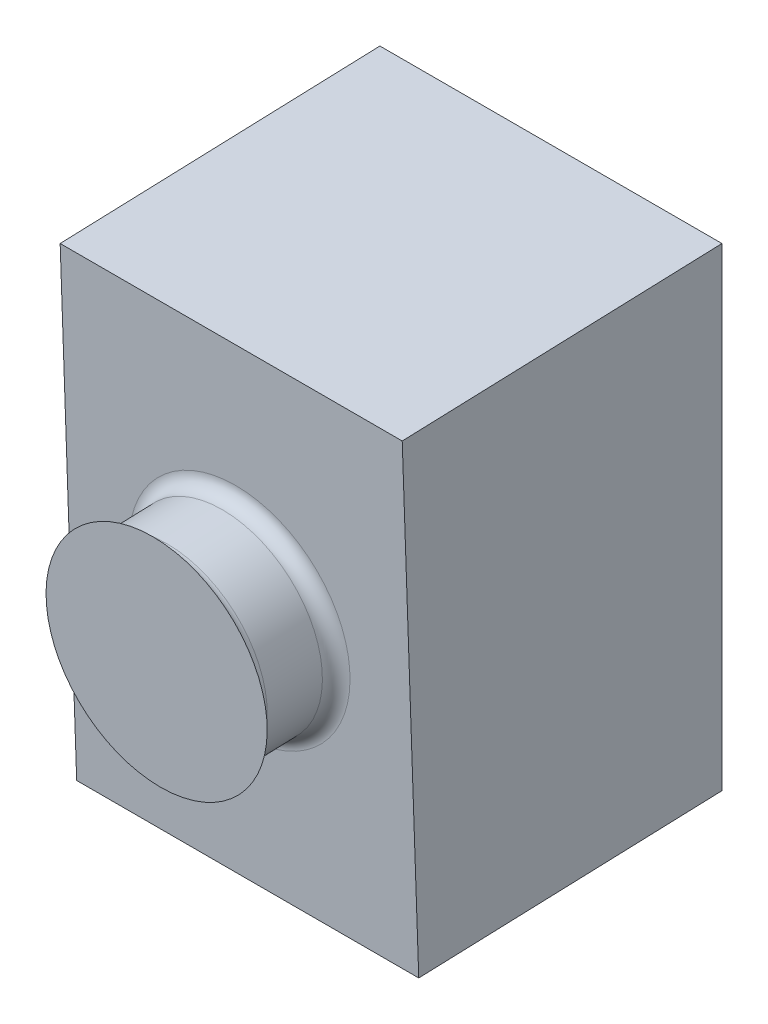
ISO-10303-21;
HEADER;
FILE_DESCRIPTION(('STEP AP214'),'2;1');
FILE_NAME('part.step','',(''),(''),'','','');
FILE_SCHEMA(('AUTOMOTIVE_DESIGN { 1 0 10303 214 1 1 1 1 }'));
ENDSEC;
DATA;
#1=APPLICATION_CONTEXT('core data for automotive mechanical design processes');
#2=APPLICATION_PROTOCOL_DEFINITION('international standard','automotive_design',2000,#1);
#3=PRODUCT_CONTEXT('',#1,'mechanical');
#4=PRODUCT('Part','Part','',(#3));
#5=PRODUCT_RELATED_PRODUCT_CATEGORY('part','',(#4));
#6=PRODUCT_DEFINITION_FORMATION('','',#4);
#7=PRODUCT_DEFINITION_CONTEXT('part definition',#1,'design');
#8=PRODUCT_DEFINITION('design','',#6,#7);
#9=PRODUCT_DEFINITION_SHAPE('','',#8);
#10=(LENGTH_UNIT() NAMED_UNIT(*) SI_UNIT(.MILLI.,.METRE.));
#11=(NAMED_UNIT(*) PLANE_ANGLE_UNIT() SI_UNIT($,.RADIAN.));
#12=(NAMED_UNIT(*) SI_UNIT($,.STERADIAN.) SOLID_ANGLE_UNIT());
#13=UNCERTAINTY_MEASURE_WITH_UNIT(LENGTH_MEASURE(1.E-05),#10,'distance_accuracy_value','');
#14=(GEOMETRIC_REPRESENTATION_CONTEXT(3) GLOBAL_UNCERTAINTY_ASSIGNED_CONTEXT((#13)) GLOBAL_UNIT_ASSIGNED_CONTEXT((#10,
#11,#12)) REPRESENTATION_CONTEXT('',''));
#15=CARTESIAN_POINT('',(0.,0.,0.));
#16=DIRECTION('',(0.,0.,1.));
#17=DIRECTION('',(1.,0.,0.));
#18=AXIS2_PLACEMENT_3D('',#15,#16,#17);
#19=CARTESIAN_POINT('',(17.6407815322395,86.3305706565637,-76.4773662710932));
#20=DIRECTION('',(0.,-0.999390827019096,-0.034899496702501));
#21=DIRECTION('',(0.,0.034899496702501,-0.999390827019096));
#22=AXIS2_PLACEMENT_3D('',#19,#20,#21);
#23=PLANE('',#22);
#24=DIRECTION('',(-1.,0.,0.));
#25=VECTOR('',#24,1.);
#26=CARTESIAN_POINT('',(-45.,86.7329498929487,-88.));
#27=LINE('',#26,#25);
#28=CARTESIAN_POINT('',(17.6407815322395,86.7329498929487,-88.));
#29=VERTEX_POINT('',#28);
#30=CARTESIAN_POINT('',(4.64078153223947,86.7329498929487,-88.));
#31=VERTEX_POINT('',#30);
#32=EDGE_CURVE('E98',#29,#31,#27,.T.);
#33=ORIENTED_EDGE('',*,*,#32,.F.);
#34=DIRECTION('',(0.,0.034899496702501,-0.999390827019096));
#35=VECTOR('',#34,1.);
#36=CARTESIAN_POINT('',(17.6407815322395,86.3305706565637,-76.4773662710932));
#37=LINE('',#36,#35);
#38=CARTESIAN_POINT('',(17.6407815322395,86.3305706565637,-76.4773662710932));
#39=VERTEX_POINT('',#38);
#40=EDGE_CURVE('E11',#39,#29,#37,.T.);
#41=ORIENTED_EDGE('',*,*,#40,.F.);
#42=DIRECTION('',(-1.,0.,0.));
#43=VECTOR('',#42,1.);
#44=CARTESIAN_POINT('',(36.7816402639117,86.3305706565637,-76.4773662710932));
#45=LINE('',#44,#43);
#46=CARTESIAN_POINT('',(4.64078153223947,86.3305706565637,-76.4773662710932));
#47=VERTEX_POINT('',#46);
#48=EDGE_CURVE('E108',#47,#39,#45,.F.);
#49=ORIENTED_EDGE('',*,*,#48,.F.);
#50=DIRECTION('',(0.,0.034899496702501,-0.999390827019096));
#51=VECTOR('',#50,1.);
#52=CARTESIAN_POINT('',(4.64078153223947,86.3305706565637,-76.4773662710932));
#53=LINE('',#52,#51);
#54=EDGE_CURVE('E49',#47,#31,#53,.T.);
#55=ORIENTED_EDGE('',*,*,#54,.T.);
#56=EDGE_LOOP('',(#33,#41,#49,#55));
#57=FACE_BOUND('',#56,.T.);
#58=ADVANCED_FACE('F40',(#57),#23,.T.);
#59=CARTESIAN_POINT('',(17.6407815322395,104.319605542907,-75.8491753304482));
#60=DIRECTION('',(1.,0.,0.));
#61=DIRECTION('',(0.,1.,0.));
#62=AXIS2_PLACEMENT_3D('',#59,#60,#61);
#63=PLANE('',#62);
#64=DIRECTION('',(0.,-1.,0.));
#65=VECTOR('',#64,1.);
#66=CARTESIAN_POINT('',(17.6407815322395,63.7622062124586,-88.));
#67=LINE('',#66,#65);
#68=CARTESIAN_POINT('',(17.6407815322395,104.743921690327,-88.));
#69=VERTEX_POINT('',#68);
#70=EDGE_CURVE('E96',#69,#29,#67,.T.);
#71=ORIENTED_EDGE('',*,*,#70,.F.);
#72=DIRECTION('',(0.,0.034899496702501,-0.999390827019096));
#73=VECTOR('',#72,1.);
#74=CARTESIAN_POINT('',(17.6407815322395,104.319605542907,-75.8491753304482));
#75=LINE('',#74,#73);
#76=CARTESIAN_POINT('',(17.6407815322395,104.319605542907,-75.8491753304482));
#77=VERTEX_POINT('',#76);
#78=EDGE_CURVE('E87',#77,#69,#75,.T.);
#79=ORIENTED_EDGE('',*,*,#78,.F.);
#80=DIRECTION('',(0.,-0.999390827019096,-0.034899496702501));
#81=VECTOR('',#80,1.);
#82=CARTESIAN_POINT('',(17.6407815322395,78.7622062124586,-76.7416593812754));
#83=LINE('',#82,#81);
#84=EDGE_CURVE('E105',#39,#77,#83,.F.);
#85=ORIENTED_EDGE('',*,*,#84,.F.);
#86=ORIENTED_EDGE('',*,*,#40,.T.);
#87=EDGE_LOOP('',(#71,#79,#85,#86));
#88=FACE_BOUND('',#87,.T.);
#89=ADVANCED_FACE('F141',(#88),#63,.T.);
#90=CARTESIAN_POINT('',(4.64078153223947,104.319605542907,-75.8491753304482));
#91=DIRECTION('',(-1.,0.,0.));
#92=DIRECTION('',(0.,0.,1.));
#93=AXIS2_PLACEMENT_3D('',#90,#91,#92);
#94=PLANE('',#93);
#95=DIRECTION('',(0.,1.,0.));
#96=VECTOR('',#95,1.);
#97=CARTESIAN_POINT('',(4.64078153223946,63.7622062124586,-88.));
#98=LINE('',#97,#96);
#99=CARTESIAN_POINT('',(4.64078153223947,104.743921690327,-88.));
#100=VERTEX_POINT('',#99);
#101=EDGE_CURVE('E44',#31,#100,#98,.T.);
#102=ORIENTED_EDGE('',*,*,#101,.F.);
#103=ORIENTED_EDGE('',*,*,#54,.F.);
#104=DIRECTION('',(0.,0.999390827019096,0.034899496702501));
#105=VECTOR('',#104,1.);
#106=CARTESIAN_POINT('',(4.64078153223947,78.7622062124586,-76.7416593812754));
#107=LINE('',#106,#105);
#108=CARTESIAN_POINT('',(4.64078153223947,104.319605542907,-75.8491753304482));
#109=VERTEX_POINT('',#108);
#110=EDGE_CURVE('E83',#109,#47,#107,.F.);
#111=ORIENTED_EDGE('',*,*,#110,.F.);
#112=DIRECTION('',(0.,0.034899496702501,-0.999390827019096));
#113=VECTOR('',#112,1.);
#114=CARTESIAN_POINT('',(4.64078153223947,104.319605542907,-75.8491753304482));
#115=LINE('',#114,#113);
#116=EDGE_CURVE('E78',#109,#100,#115,.T.);
#117=ORIENTED_EDGE('',*,*,#116,.T.);
#118=EDGE_LOOP('',(#102,#103,#111,#117));
#119=FACE_BOUND('',#118,.T.);
#120=ADVANCED_FACE('F80',(#119),#94,.T.);
#121=CARTESIAN_POINT('',(17.6407815322395,104.319605542907,-75.8491753304482));
#122=DIRECTION('',(0.,0.999390827019096,0.034899496702501));
#123=DIRECTION('',(0.,-0.034899496702501,0.999390827019096));
#124=AXIS2_PLACEMENT_3D('',#121,#122,#123);
#125=PLANE('',#124);
#126=DIRECTION('',(1.,0.,0.));
#127=VECTOR('',#126,1.);
#128=CARTESIAN_POINT('',(-45.,104.743921690327,-88.));
#129=LINE('',#128,#127);
#130=EDGE_CURVE('E91',#100,#69,#129,.T.);
#131=ORIENTED_EDGE('',*,*,#130,.F.);
#132=ORIENTED_EDGE('',*,*,#116,.F.);
#133=DIRECTION('',(1.,0.,0.));
#134=VECTOR('',#133,1.);
#135=CARTESIAN_POINT('',(36.7816402639117,104.319605542907,-75.8491753304482));
#136=LINE('',#135,#134);
#137=EDGE_CURVE('E100',#77,#109,#136,.F.);
#138=ORIENTED_EDGE('',*,*,#137,.F.);
#139=ORIENTED_EDGE('',*,*,#78,.T.);
#140=EDGE_LOOP('',(#131,#132,#138,#139));
#141=FACE_BOUND('',#140,.T.);
#142=ADVANCED_FACE('F92',(#141),#125,.T.);
#143=CARTESIAN_POINT('',(0.,81.1700432826324,-73.5056557934329));
#144=DIRECTION('',(0.,-0.0348994967025025,0.999390827019096));
#145=DIRECTION('',(0.,-0.999390827019096,-0.0348994967025025));
#146=AXIS2_PLACEMENT_3D('',#143,#144,#145);
#147=PLANE('',#146);
#148=CARTESIAN_POINT('',(11.1407815322395,95.2151546851227,-73.0151896956606));
#149=DIRECTION('',(0.,-0.0348994967025025,0.999390827019096));
#150=DIRECTION('',(0.,-0.999390827019096,-0.0348994967025025));
#151=AXIS2_PLACEMENT_3D('',#148,#149,#150);
#152=CIRCLE('',#151,4.2);
#153=CARTESIAN_POINT('',(11.1407815322395,91.0177132116425,-73.1617675818111));
#154=VERTEX_POINT('',#153);
#155=EDGE_CURVE('E116',#154,#154,#152,.F.);
#156=ORIENTED_EDGE('',*,*,#155,.F.);
#157=EDGE_LOOP('',(#156));
#158=FACE_BOUND('',#157,.T.);
#159=ADVANCED_FACE('F130',(#158),#147,.T.);
#160=CARTESIAN_POINT('',(11.1407815322395,95.2334769208915,-73.5398698798456));
#161=DIRECTION('',(0.,0.034899496702501,-0.999390827019096));
#162=DIRECTION('',(0.,0.999390827019096,0.034899496702501));
#163=AXIS2_PLACEMENT_3D('',#160,#161,#162);
#164=TOROIDAL_SURFACE('',#163,4.2,0.525);
#165=CARTESIAN_POINT('',(11.1407815322395,95.2334769208915,-73.5398698798456));
#166=DIRECTION('',(0.,0.034899496702501,-0.999390827019096));
#167=DIRECTION('',(0.,0.999390827019096,0.034899496702501));
#168=AXIS2_PLACEMENT_3D('',#165,#166,#167);
#169=CIRCLE('',#168,3.675);
#170=CARTESIAN_POINT('',(11.1407815322395,98.9062382101866,-73.4116142294639));
#171=VERTEX_POINT('',#170);
#172=EDGE_CURVE('E88',#171,#171,#169,.F.);
#173=ORIENTED_EDGE('',*,*,#172,.T.);
#174=EDGE_LOOP('',(#173));
#175=FACE_BOUND('',#174,.T.);
#176=ORIENTED_EDGE('',*,*,#155,.T.);
#177=EDGE_LOOP('',(#176));
#178=FACE_BOUND('',#177,.T.);
#179=ADVANCED_FACE('F128',(#175,#178),#164,.F.);
#180=CARTESIAN_POINT('',(11.1407815322395,94.8523929246811,-62.6270520423003));
#181=DIRECTION('',(0.,0.034899496702501,-0.999390827019096));
#182=DIRECTION('',(0.,0.999390827019096,0.034899496702501));
#183=AXIS2_PLACEMENT_3D('',#180,#181,#182);
#184=CYLINDRICAL_SURFACE('',#183,3.675);
#185=ORIENTED_EDGE('',*,*,#172,.F.);
#186=EDGE_LOOP('',(#185));
#187=FACE_BOUND('',#186,.T.);
#188=CARTESIAN_POINT('',(11.1407815322395,95.3067658639667,-75.6385906165857));
#189=DIRECTION('',(0.,0.034899496702501,-0.999390827019096));
#190=DIRECTION('',(0.,0.999390827019096,0.034899496702501));
#191=AXIS2_PLACEMENT_3D('',#188,#189,#190);
#192=CIRCLE('',#191,3.675);
#193=CARTESIAN_POINT('',(11.1407815322395,98.9795271532619,-75.510334966204));
#194=VERTEX_POINT('',#193);
#195=EDGE_CURVE('E109',#194,#194,#192,.T.);
#196=ORIENTED_EDGE('',*,*,#195,.F.);
#197=EDGE_LOOP('',(#196));
#198=FACE_BOUND('',#197,.T.);
#199=ADVANCED_FACE('F137',(#187,#198),#184,.T.);
#200=CARTESIAN_POINT('',(11.1407815322395,95.3067658639667,-75.6385906165857));
#201=DIRECTION('',(0.,0.034899496702501,-0.999390827019096));
#202=DIRECTION('',(0.,0.999390827019096,0.034899496702501));
#203=AXIS2_PLACEMENT_3D('',#200,#201,#202);
#204=TOROIDAL_SURFACE('',#203,4.2,0.525);
#205=CARTESIAN_POINT('',(11.1407815322395,95.3250880997355,-76.1632708007707));
#206=DIRECTION('',(0.,0.034899496702501,-0.999390827019096));
#207=DIRECTION('',(0.,0.999390827019096,0.034899496702501));
#208=AXIS2_PLACEMENT_3D('',#205,#206,#207);
#209=CIRCLE('',#208,4.2);
#210=CARTESIAN_POINT('',(11.1407815322395,99.5225295732157,-76.0166929146202));
#211=VERTEX_POINT('',#210);
#212=EDGE_CURVE('E113',#211,#211,#209,.F.);
#213=ORIENTED_EDGE('',*,*,#212,.T.);
#214=EDGE_LOOP('',(#213));
#215=FACE_BOUND('',#214,.T.);
#216=ORIENTED_EDGE('',*,*,#195,.T.);
#217=EDGE_LOOP('',(#216));
#218=FACE_BOUND('',#217,.T.);
#219=ADVANCED_FACE('F152',(#215,#218),#204,.F.);
#220=CARTESIAN_POINT('',(36.7816402639117,78.7622062124586,-76.7416593812754));
#221=DIRECTION('',(0.,0.034899496702501,-0.999390827019096));
#222=DIRECTION('',(0.,0.999390827019096,0.034899496702501));
#223=AXIS2_PLACEMENT_3D('',#220,#221,#222);
#224=PLANE('',#223);
#225=ORIENTED_EDGE('',*,*,#212,.F.);
#226=EDGE_LOOP('',(#225));
#227=FACE_BOUND('',#226,.T.);
#228=ORIENTED_EDGE('',*,*,#137,.T.);
#229=ORIENTED_EDGE('',*,*,#110,.T.);
#230=ORIENTED_EDGE('',*,*,#48,.T.);
#231=ORIENTED_EDGE('',*,*,#84,.T.);
#232=EDGE_LOOP('',(#228,#229,#230,#231));
#233=FACE_BOUND('',#232,.T.);
#234=ADVANCED_FACE('F150',(#227,#233),#224,.F.);
#235=CARTESIAN_POINT('',(-45.,63.7622062124586,-88.));
#236=DIRECTION('',(0.,0.,-1.));
#237=DIRECTION('',(-1.,0.,0.));
#238=AXIS2_PLACEMENT_3D('',#235,#236,#237);
#239=PLANE('',#238);
#240=ORIENTED_EDGE('',*,*,#32,.T.);
#241=ORIENTED_EDGE('',*,*,#101,.T.);
#242=ORIENTED_EDGE('',*,*,#130,.T.);
#243=ORIENTED_EDGE('',*,*,#70,.T.);
#244=EDGE_LOOP('',(#240,#241,#242,#243));
#245=FACE_BOUND('',#244,.T.);
#246=ADVANCED_FACE('F42',(#245),#239,.T.);
#247=CLOSED_SHELL('',(#58,#89,#120,#142,#159,#179,#199,#219,#234,#246));
#248=MANIFOLD_SOLID_BREP('B2',#247);
#249=ADVANCED_BREP_SHAPE_REPRESENTATION('',(#18,#248),#14);
#250=SHAPE_DEFINITION_REPRESENTATION(#9,#249);
ENDSEC;
END-ISO-10303-21;
